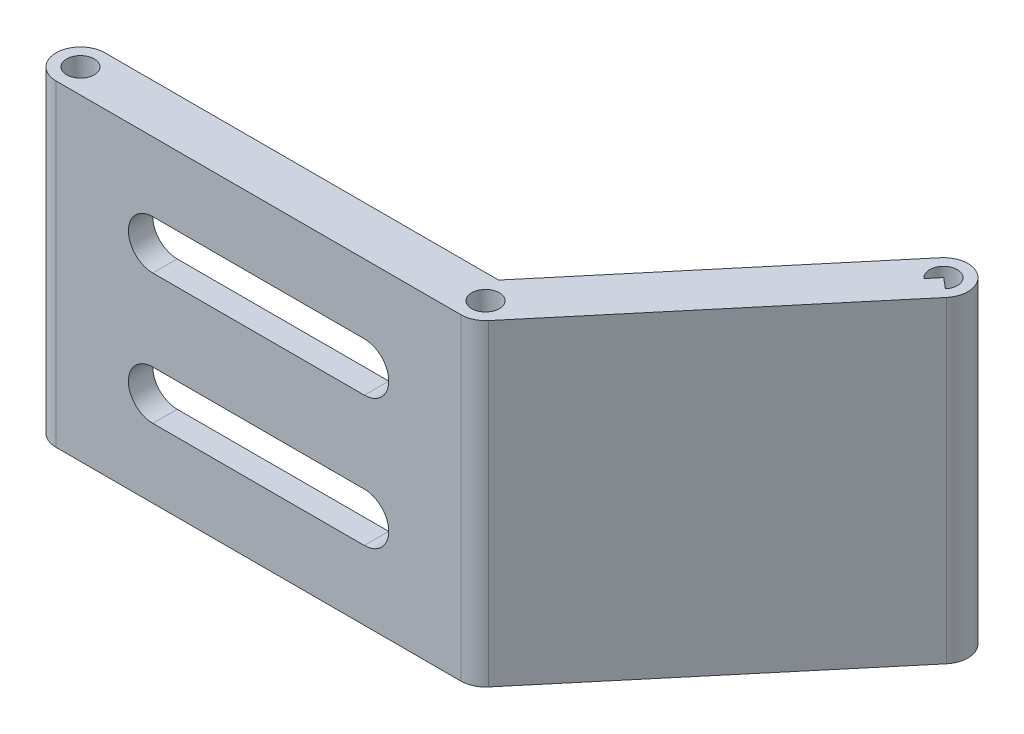
ISO-10303-21;
HEADER;
FILE_DESCRIPTION(('STEP AP214'),'2;1');
FILE_NAME('part.step','',(''),(''),'','','');
FILE_SCHEMA(('AUTOMOTIVE_DESIGN { 1 0 10303 214 1 1 1 1 }'));
ENDSEC;
DATA;
#1=APPLICATION_CONTEXT('core data for automotive mechanical design processes');
#2=APPLICATION_PROTOCOL_DEFINITION('international standard','automotive_design',2000,#1);
#3=PRODUCT_CONTEXT('',#1,'mechanical');
#4=PRODUCT('Part','Part','',(#3));
#5=PRODUCT_RELATED_PRODUCT_CATEGORY('part','',(#4));
#6=PRODUCT_DEFINITION_FORMATION('','',#4);
#7=PRODUCT_DEFINITION_CONTEXT('part definition',#1,'design');
#8=PRODUCT_DEFINITION('design','',#6,#7);
#9=PRODUCT_DEFINITION_SHAPE('','',#8);
#10=(LENGTH_UNIT() NAMED_UNIT(*) SI_UNIT(.MILLI.,.METRE.));
#11=(NAMED_UNIT(*) PLANE_ANGLE_UNIT() SI_UNIT($,.RADIAN.));
#12=(NAMED_UNIT(*) SI_UNIT($,.STERADIAN.) SOLID_ANGLE_UNIT());
#13=UNCERTAINTY_MEASURE_WITH_UNIT(LENGTH_MEASURE(1.E-05),#10,'distance_accuracy_value','');
#14=(GEOMETRIC_REPRESENTATION_CONTEXT(3) GLOBAL_UNCERTAINTY_ASSIGNED_CONTEXT((#13)) GLOBAL_UNIT_ASSIGNED_CONTEXT((#10,
#11,#12)) REPRESENTATION_CONTEXT('',''));
#15=CARTESIAN_POINT('',(0.,0.,0.));
#16=DIRECTION('',(0.,0.,1.));
#17=DIRECTION('',(1.,0.,0.));
#18=AXIS2_PLACEMENT_3D('',#15,#16,#17);
#19=CARTESIAN_POINT('',(61.1988808877318,39.,-30.620225145052));
#20=DIRECTION('',(-0.642787609686542,0.,0.766044443118975));
#21=DIRECTION('',(0.766044443118976,0.,0.642787609686542));
#22=AXIS2_PLACEMENT_3D('',#19,#20,#21);
#23=PLANE('',#22);
#24=DIRECTION('',(-0.766044443118975,0.,-0.642787609686542));
#25=VECTOR('',#24,1.);
#26=CARTESIAN_POINT('',(61.1988808877318,0.,-30.620225145052));
#27=LINE('',#26,#25);
#28=CARTESIAN_POINT('',(63.4970142170887,0.,-28.6918623159923));
#29=VERTEX_POINT('',#28);
#30=CARTESIAN_POINT('',(63.4969810572547,0.,-28.6918901403968));
#31=VERTEX_POINT('',#30);
#32=EDGE_CURVE('E493',#29,#31,#27,.T.);
#33=ORIENTED_EDGE('',*,*,#32,.T.);
#34=DIRECTION('',(0.,1.,0.));
#35=VECTOR('',#34,1.);
#36=CARTESIAN_POINT('',(63.4969810572547,36.,-28.6918901403968));
#37=LINE('',#36,#35);
#38=CARTESIAN_POINT('',(63.4969810572547,39.,-28.6918901403968));
#39=VERTEX_POINT('',#38);
#40=EDGE_CURVE('E48',#31,#39,#37,.T.);
#41=ORIENTED_EDGE('',*,*,#40,.T.);
#42=DIRECTION('',(-0.766044443118975,0.,-0.642787609686542));
#43=VECTOR('',#42,1.);
#44=CARTESIAN_POINT('',(61.1988808877318,39.,-30.620225145052));
#45=LINE('',#44,#43);
#46=CARTESIAN_POINT('',(63.4970142170887,39.,-28.6918623159923));
#47=VERTEX_POINT('',#46);
#48=EDGE_CURVE('E469',#47,#39,#45,.T.);
#49=ORIENTED_EDGE('',*,*,#48,.F.);
#50=DIRECTION('',(0.,-1.,0.));
#51=VECTOR('',#50,1.);
#52=CARTESIAN_POINT('',(63.4970142170887,39.,-28.6918623159923));
#53=LINE('',#52,#51);
#54=EDGE_CURVE('E502',#47,#29,#53,.T.);
#55=ORIENTED_EDGE('',*,*,#54,.T.);
#56=EDGE_LOOP('',(#33,#41,#49,#55));
#57=FACE_BOUND('',#56,.T.);
#58=ADVANCED_FACE('F39',(#57),#23,.F.);
#59=CARTESIAN_POINT('',(37.4338240910131,39.,-2.29813332935694));
#60=DIRECTION('',(0.766044443118979,0.,0.642787609686538));
#61=DIRECTION('',(0.642787609686538,0.,-0.766044443118979));
#62=AXIS2_PLACEMENT_3D('',#59,#60,#61);
#63=PLANE('',#62);
#64=DIRECTION('',(0.,-1.,0.));
#65=VECTOR('',#64,1.);
#66=CARTESIAN_POINT('',(59.2601589891967,39.,-28.3097463574317));
#67=LINE('',#66,#65);
#68=CARTESIAN_POINT('',(59.2601589891967,5.,-28.3097463574317));
#69=VERTEX_POINT('',#68);
#70=CARTESIAN_POINT('',(59.2601589891967,36.,-28.3097463574317));
#71=VERTEX_POINT('',#70);
#72=EDGE_CURVE('E241',#69,#71,#67,.F.);
#73=ORIENTED_EDGE('',*,*,#72,.F.);
#74=DIRECTION('',(-0.642787609686538,0.,0.766044443118979));
#75=VECTOR('',#74,1.);
#76=CARTESIAN_POINT('',(37.4338240910131,5.,-2.29813332935694));
#77=LINE('',#76,#75);
#78=CARTESIAN_POINT('',(40.8448561593638,5.,-6.3632430512679));
#79=VERTEX_POINT('',#78);
#80=EDGE_CURVE('E55',#69,#79,#77,.T.);
#81=ORIENTED_EDGE('',*,*,#80,.T.);
#82=DIRECTION('',(0.,1.,0.));
#83=VECTOR('',#82,1.);
#84=CARTESIAN_POINT('',(40.8448561593638,39.,-6.3632430512679));
#85=LINE('',#84,#83);
#86=CARTESIAN_POINT('',(40.8448561593638,36.,-6.3632430512679));
#87=VERTEX_POINT('',#86);
#88=EDGE_CURVE('E522',#79,#87,#85,.T.);
#89=ORIENTED_EDGE('',*,*,#88,.T.);
#90=DIRECTION('',(-0.642787609686538,0.,0.766044443118979));
#91=VECTOR('',#90,1.);
#92=CARTESIAN_POINT('',(37.4338240910131,36.,-2.29813332935694));
#93=LINE('',#92,#91);
#94=EDGE_CURVE('E286',#71,#87,#93,.T.);
#95=ORIENTED_EDGE('',*,*,#94,.F.);
#96=EDGE_LOOP('',(#73,#81,#89,#95));
#97=FACE_BOUND('',#96,.T.);
#98=ADVANCED_FACE('F617',(#97),#63,.F.);
#99=CARTESIAN_POINT('',(-14.2777011975798,5.,0.));
#100=DIRECTION('',(0.,1.,0.));
#101=DIRECTION('',(0.,0.,1.));
#102=AXIS2_PLACEMENT_3D('',#99,#100,#101);
#103=PLANE('',#102);
#104=ORIENTED_EDGE('',*,*,#80,.F.);
#105=CARTESIAN_POINT('',(61.1885218182563,5.,-30.6078796867887));
#106=DIRECTION('',(0.,1.,0.));
#107=DIRECTION('',(0.,0.,1.));
#108=AXIS2_PLACEMENT_3D('',#105,#106,#107);
#109=CIRCLE('',#108,3.00000000000005);
#110=CARTESIAN_POINT('',(58.8903884888994,5.,-32.5362425158483));
#111=VERTEX_POINT('',#110);
#112=EDGE_CURVE('E233',#69,#111,#109,.F.);
#113=ORIENTED_EDGE('',*,*,#112,.T.);
#114=DIRECTION('',(-0.642787609686538,0.,0.766044443118979));
#115=VECTOR('',#114,1.);
#116=CARTESIAN_POINT('',(33.2073279325966,5.,-1.92836282905961));
#117=LINE('',#116,#115);
#118=CARTESIAN_POINT('',(34.1065382874885,5.,-3.));
#119=VERTEX_POINT('',#118);
#120=EDGE_CURVE('E237',#111,#119,#117,.T.);
#121=ORIENTED_EDGE('',*,*,#120,.T.);
#122=DIRECTION('',(-1.,0.,0.));
#123=VECTOR('',#122,1.);
#124=CARTESIAN_POINT('',(-14.2777011975798,5.,-3.));
#125=LINE('',#124,#123);
#126=CARTESIAN_POINT('',(-14.2777011975798,5.,-3.));
#127=VERTEX_POINT('',#126);
#128=EDGE_CURVE('E408',#119,#127,#125,.T.);
#129=ORIENTED_EDGE('',*,*,#128,.T.);
#130=CARTESIAN_POINT('',(-14.2777011975798,5.,0.));
#131=DIRECTION('',(0.,1.,0.));
#132=DIRECTION('',(0.,0.,1.));
#133=AXIS2_PLACEMENT_3D('',#130,#131,#132);
#134=CIRCLE('',#133,3.);
#135=CARTESIAN_POINT('',(-12.3607879984449,5.,-2.30769230769231));
#136=VERTEX_POINT('',#135);
#137=EDGE_CURVE('E417',#136,#127,#134,.T.);
#138=ORIENTED_EDGE('',*,*,#137,.F.);
#139=CARTESIAN_POINT('',(-5.97107733466174,5.,-10.));
#140=DIRECTION('',(0.,1.,0.));
#141=DIRECTION('',(0.,0.,1.));
#142=AXIS2_PLACEMENT_3D('',#139,#140,#141);
#143=CIRCLE('',#142,10.);
#144=CARTESIAN_POINT('',(-5.97107733466174,5.,0.));
#145=VERTEX_POINT('',#144);
#146=EDGE_CURVE('E442',#145,#136,#143,.F.);
#147=ORIENTED_EDGE('',*,*,#146,.F.);
#148=DIRECTION('',(-1.,0.,0.));
#149=VECTOR('',#148,1.);
#150=CARTESIAN_POINT('',(-11.2777011975798,5.,0.));
#151=LINE('',#150,#149);
#152=CARTESIAN_POINT('',(27.1988373990354,5.,0.));
#153=VERTEX_POINT('',#152);
#154=EDGE_CURVE('E421',#153,#145,#151,.T.);
#155=ORIENTED_EDGE('',*,*,#154,.F.);
#156=CARTESIAN_POINT('',(27.1988373990354,5.,-10.));
#157=DIRECTION('',(0.,1.,0.));
#158=DIRECTION('',(0.,0.,1.));
#159=AXIS2_PLACEMENT_3D('',#156,#157,#158);
#160=CIRCLE('',#159,10.);
#161=CARTESIAN_POINT('',(33.5885480628186,5.,-2.30769230769231));
#162=VERTEX_POINT('',#161);
#163=EDGE_CURVE('E425',#162,#153,#160,.F.);
#164=ORIENTED_EDGE('',*,*,#163,.F.);
#165=CARTESIAN_POINT('',(35.5054612619535,5.,0.));
#166=DIRECTION('',(0.,1.,0.));
#167=DIRECTION('',(0.,0.,1.));
#168=AXIS2_PLACEMENT_3D('',#165,#166,#167);
#169=CIRCLE('',#168,3.);
#170=CARTESIAN_POINT('',(34.9698344464659,5.,-2.9517967264923));
#171=VERTEX_POINT('',#170);
#172=EDGE_CURVE('E428',#171,#162,#169,.T.);
#173=ORIENTED_EDGE('',*,*,#172,.F.);
#174=CARTESIAN_POINT('',(33.184411728174,5.,-12.7911191481333));
#175=DIRECTION('',(0.,1.,0.));
#176=DIRECTION('',(0.,0.,1.));
#177=AXIS2_PLACEMENT_3D('',#174,#175,#176);
#178=CIRCLE('',#177,10.);
#179=EDGE_CURVE('E432',#79,#171,#178,.F.);
#180=ORIENTED_EDGE('',*,*,#179,.F.);
#181=EDGE_LOOP('',(#104,#113,#121,#129,#138,#147,#155,#164,#173,#180));
#182=FACE_BOUND('',#181,.T.);
#183=ADVANCED_FACE('F235',(#182),#103,.T.);
#184=CARTESIAN_POINT('',(-14.2777011975798,36.,0.));
#185=DIRECTION('',(0.,1.,0.));
#186=DIRECTION('',(0.,0.,1.));
#187=AXIS2_PLACEMENT_3D('',#184,#185,#186);
#188=PLANE('',#187);
#189=CARTESIAN_POINT('',(61.1885218182563,36.,-30.6078796867887));
#190=DIRECTION('',(0.,1.,0.));
#191=DIRECTION('',(0.,0.,1.));
#192=AXIS2_PLACEMENT_3D('',#189,#190,#191);
#193=CIRCLE('',#192,3.00000000000005);
#194=CARTESIAN_POINT('',(58.8903884888994,36.,-32.5362425158483));
#195=VERTEX_POINT('',#194);
#196=EDGE_CURVE('E555',#71,#195,#193,.F.);
#197=ORIENTED_EDGE('',*,*,#196,.F.);
#198=ORIENTED_EDGE('',*,*,#94,.T.);
#199=CARTESIAN_POINT('',(33.184411728174,36.,-12.7911191481333));
#200=DIRECTION('',(0.,1.,0.));
#201=DIRECTION('',(0.,0.,1.));
#202=AXIS2_PLACEMENT_3D('',#199,#200,#201);
#203=CIRCLE('',#202,10.);
#204=CARTESIAN_POINT('',(34.9698344464659,36.,-2.9517967264923));
#205=VERTEX_POINT('',#204);
#206=EDGE_CURVE('E404',#87,#205,#203,.F.);
#207=ORIENTED_EDGE('',*,*,#206,.T.);
#208=CARTESIAN_POINT('',(35.5054612619535,36.,0.));
#209=DIRECTION('',(0.,1.,0.));
#210=DIRECTION('',(0.,0.,1.));
#211=AXIS2_PLACEMENT_3D('',#208,#209,#210);
#212=CIRCLE('',#211,3.);
#213=CARTESIAN_POINT('',(33.5885480628186,36.,-2.30769230769231));
#214=VERTEX_POINT('',#213);
#215=EDGE_CURVE('E401',#205,#214,#212,.T.);
#216=ORIENTED_EDGE('',*,*,#215,.T.);
#217=CARTESIAN_POINT('',(27.1988373990354,36.,-10.));
#218=DIRECTION('',(0.,1.,0.));
#219=DIRECTION('',(0.,0.,1.));
#220=AXIS2_PLACEMENT_3D('',#217,#218,#219);
#221=CIRCLE('',#220,10.);
#222=CARTESIAN_POINT('',(27.1988373990354,36.,0.));
#223=VERTEX_POINT('',#222);
#224=EDGE_CURVE('E398',#214,#223,#221,.F.);
#225=ORIENTED_EDGE('',*,*,#224,.T.);
#226=DIRECTION('',(-1.,0.,0.));
#227=VECTOR('',#226,1.);
#228=CARTESIAN_POINT('',(-11.2777011975798,36.,0.));
#229=LINE('',#228,#227);
#230=CARTESIAN_POINT('',(-5.97107733466174,36.,0.));
#231=VERTEX_POINT('',#230);
#232=EDGE_CURVE('E395',#223,#231,#229,.T.);
#233=ORIENTED_EDGE('',*,*,#232,.T.);
#234=CARTESIAN_POINT('',(-5.97107733466174,36.,-10.));
#235=DIRECTION('',(0.,1.,0.));
#236=DIRECTION('',(0.,0.,1.));
#237=AXIS2_PLACEMENT_3D('',#234,#235,#236);
#238=CIRCLE('',#237,10.);
#239=CARTESIAN_POINT('',(-12.3607879984449,36.,-2.30769230769231));
#240=VERTEX_POINT('',#239);
#241=EDGE_CURVE('E446',#231,#240,#238,.F.);
#242=ORIENTED_EDGE('',*,*,#241,.T.);
#243=CARTESIAN_POINT('',(-14.2777011975798,36.,0.));
#244=DIRECTION('',(0.,1.,0.));
#245=DIRECTION('',(0.,0.,1.));
#246=AXIS2_PLACEMENT_3D('',#243,#244,#245);
#247=CIRCLE('',#246,3.);
#248=CARTESIAN_POINT('',(-14.2777011975798,36.,-3.));
#249=VERTEX_POINT('',#248);
#250=EDGE_CURVE('E391',#240,#249,#247,.T.);
#251=ORIENTED_EDGE('',*,*,#250,.T.);
#252=DIRECTION('',(-1.,0.,0.));
#253=VECTOR('',#252,1.);
#254=CARTESIAN_POINT('',(-14.2777011975798,36.,-3.));
#255=LINE('',#254,#253);
#256=CARTESIAN_POINT('',(34.1065382874885,36.,-3.));
#257=VERTEX_POINT('',#256);
#258=EDGE_CURVE('E382',#257,#249,#255,.T.);
#259=ORIENTED_EDGE('',*,*,#258,.F.);
#260=DIRECTION('',(-0.642787609686538,0.,0.766044443118979));
#261=VECTOR('',#260,1.);
#262=CARTESIAN_POINT('',(33.2073279325966,36.,-1.92836282905961));
#263=LINE('',#262,#261);
#264=EDGE_CURVE('E270',#195,#257,#263,.T.);
#265=ORIENTED_EDGE('',*,*,#264,.F.);
#266=EDGE_LOOP('',(#197,#198,#207,#216,#225,#233,#242,#251,#259,#265));
#267=FACE_BOUND('',#266,.T.);
#268=ADVANCED_FACE('F611',(#267),#188,.F.);
#269=DIRECTION('',(0.,1.,0.));
#270=VECTOR('',#269,1.);
#271=CARTESIAN_POINT('',(62.5010979227874,36.,-29.527535311224));
#272=LINE('',#271,#270);
#273=CARTESIAN_POINT('',(62.5010979227874,0.,-29.527535311224));
#274=VERTEX_POINT('',#273);
#275=CARTESIAN_POINT('',(62.5010979227874,39.,-29.527535311224));
#276=VERTEX_POINT('',#275);
#277=EDGE_CURVE('E289',#274,#276,#272,.T.);
#278=ORIENTED_EDGE('',*,*,#277,.F.);
#279=CARTESIAN_POINT('',(61.1988808877318,0.,-30.620225145052));
#280=VERTEX_POINT('',#279);
#281=EDGE_CURVE('E492',#274,#280,#27,.T.);
#282=ORIENTED_EDGE('',*,*,#281,.T.);
#283=DIRECTION('',(0.,-1.,0.));
#284=VECTOR('',#283,1.);
#285=CARTESIAN_POINT('',(61.1988808877318,39.,-30.620225145052));
#286=LINE('',#285,#284);
#287=CARTESIAN_POINT('',(61.1988808877318,39.,-30.620225145052));
#288=VERTEX_POINT('',#287);
#289=EDGE_CURVE('E477',#288,#280,#286,.T.);
#290=ORIENTED_EDGE('',*,*,#289,.F.);
#291=EDGE_CURVE('E468',#276,#288,#45,.T.);
#292=ORIENTED_EDGE('',*,*,#291,.F.);
#293=EDGE_LOOP('',(#278,#282,#290,#292));
#294=FACE_BOUND('',#293,.T.);
#295=ADVANCED_FACE('F633',(#294),#23,.F.);
#296=CARTESIAN_POINT('',(-14.2777011975798,5.,-3.));
#297=DIRECTION('',(0.,0.,1.));
#298=DIRECTION('',(1.,0.,0.));
#299=AXIS2_PLACEMENT_3D('',#296,#297,#298);
#300=PLANE('',#299);
#301=DIRECTION('',(0.,1.,0.));
#302=VECTOR('',#301,1.);
#303=CARTESIAN_POINT('',(34.1065382874885,5.,-3.));
#304=LINE('',#303,#302);
#305=CARTESIAN_POINT('',(34.1065382874885,0.,-3.));
#306=VERTEX_POINT('',#305);
#307=EDGE_CURVE('E11',#306,#119,#304,.T.);
#308=ORIENTED_EDGE('',*,*,#307,.F.);
#309=DIRECTION('',(-1.,0.,0.));
#310=VECTOR('',#309,1.);
#311=CARTESIAN_POINT('',(-14.2777011975798,0.,-3.));
#312=LINE('',#311,#310);
#313=CARTESIAN_POINT('',(-14.2777011975798,0.,-3.));
#314=VERTEX_POINT('',#313);
#315=EDGE_CURVE('E407',#306,#314,#312,.T.);
#316=ORIENTED_EDGE('',*,*,#315,.T.);
#317=DIRECTION('',(0.,-1.,0.));
#318=VECTOR('',#317,1.);
#319=CARTESIAN_POINT('',(-14.2777011975798,5.,-3.));
#320=LINE('',#319,#318);
#321=EDGE_CURVE('E411',#127,#314,#320,.T.);
#322=ORIENTED_EDGE('',*,*,#321,.F.);
#323=ORIENTED_EDGE('',*,*,#128,.F.);
#324=EDGE_LOOP('',(#308,#316,#322,#323));
#325=FACE_BOUND('',#324,.T.);
#326=ADVANCED_FACE('F590',(#325),#300,.F.);
#327=CARTESIAN_POINT('',(33.184411728174,39.,-12.7911191481333));
#328=DIRECTION('',(0.,-1.,0.));
#329=DIRECTION('',(0.,0.,-1.));
#330=AXIS2_PLACEMENT_3D('',#327,#328,#329);
#331=CYLINDRICAL_SURFACE('',#330,10.);
#332=ORIENTED_EDGE('',*,*,#88,.F.);
#333=ORIENTED_EDGE('',*,*,#179,.T.);
#334=DIRECTION('',(0.,-1.,0.));
#335=VECTOR('',#334,1.);
#336=CARTESIAN_POINT('',(34.9698344464659,39.,-2.9517967264923));
#337=LINE('',#336,#335);
#338=EDGE_CURVE('E519',#205,#171,#337,.T.);
#339=ORIENTED_EDGE('',*,*,#338,.F.);
#340=ORIENTED_EDGE('',*,*,#206,.F.);
#341=EDGE_LOOP('',(#332,#333,#339,#340));
#342=FACE_BOUND('',#341,.T.);
#343=ADVANCED_FACE('F615',(#342),#331,.F.);
#344=DIRECTION('',(-0.642787609686538,0.,0.766044443118979));
#345=VECTOR('',#344,1.);
#346=CARTESIAN_POINT('',(37.4338240910131,0.,-2.29813332935694));
#347=LINE('',#346,#345);
#348=CARTESIAN_POINT('',(60.0957828817892,0.,-29.3056041334864));
#349=VERTEX_POINT('',#348);
#350=EDGE_CURVE('E459',#280,#349,#347,.T.);
#351=ORIENTED_EDGE('',*,*,#350,.T.);
#352=DIRECTION('',(0.,1.,0.));
#353=VECTOR('',#352,1.);
#354=CARTESIAN_POINT('',(60.0957828817892,36.,-29.3056041334864));
#355=LINE('',#354,#353);
#356=CARTESIAN_POINT('',(60.0957828817892,39.,-29.3056041334864));
#357=VERTEX_POINT('',#356);
#358=EDGE_CURVE('E63',#357,#349,#355,.F.);
#359=ORIENTED_EDGE('',*,*,#358,.F.);
#360=DIRECTION('',(-0.642787609686538,0.,0.766044443118979));
#361=VECTOR('',#360,1.);
#362=CARTESIAN_POINT('',(37.4338240910131,39.,-2.29813332935694));
#363=LINE('',#362,#361);
#364=EDGE_CURVE('E473',#288,#357,#363,.T.);
#365=ORIENTED_EDGE('',*,*,#364,.F.);
#366=ORIENTED_EDGE('',*,*,#289,.T.);
#367=EDGE_LOOP('',(#351,#359,#365,#366));
#368=FACE_BOUND('',#367,.T.);
#369=ADVANCED_FACE('F632',(#368),#63,.F.);
#370=CARTESIAN_POINT('',(35.5054612619535,39.,0.));
#371=DIRECTION('',(0.,-1.,0.));
#372=DIRECTION('',(0.,0.,-1.));
#373=AXIS2_PLACEMENT_3D('',#370,#371,#372);
#374=CYLINDRICAL_SURFACE('',#373,3.);
#375=ORIENTED_EDGE('',*,*,#215,.F.);
#376=ORIENTED_EDGE('',*,*,#338,.T.);
#377=ORIENTED_EDGE('',*,*,#172,.T.);
#378=DIRECTION('',(0.,-1.,0.));
#379=VECTOR('',#378,1.);
#380=CARTESIAN_POINT('',(33.5885480628186,39.,-2.30769230769231));
#381=LINE('',#380,#379);
#382=EDGE_CURVE('E515',#162,#214,#381,.F.);
#383=ORIENTED_EDGE('',*,*,#382,.T.);
#384=EDGE_LOOP('',(#375,#376,#377,#383));
#385=FACE_BOUND('',#384,.T.);
#386=ADVANCED_FACE('F606',(#385),#374,.T.);
#387=CARTESIAN_POINT('',(-11.2777011975798,39.,0.));
#388=DIRECTION('',(0.,0.,1.));
#389=DIRECTION('',(1.,0.,0.));
#390=AXIS2_PLACEMENT_3D('',#387,#388,#389);
#391=PLANE('',#390);
#392=DIRECTION('',(-1.,0.,0.));
#393=VECTOR('',#392,1.);
#394=CARTESIAN_POINT('',(-11.2777011975798,30.5,0.));
#395=LINE('',#394,#393);
#396=CARTESIAN_POINT('',(23.6138800321868,30.5,0.));
#397=VERTEX_POINT('',#396);
#398=CARTESIAN_POINT('',(-2.38611996781316,30.5,0.));
#399=VERTEX_POINT('',#398);
#400=EDGE_CURVE('E373',#397,#399,#395,.T.);
#401=ORIENTED_EDGE('',*,*,#400,.T.);
#402=CARTESIAN_POINT('',(-2.38611996781316,27.5,0.));
#403=DIRECTION('',(0.,0.,1.));
#404=DIRECTION('',(1.,0.,0.));
#405=AXIS2_PLACEMENT_3D('',#402,#403,#404);
#406=CIRCLE('',#405,3.);
#407=CARTESIAN_POINT('',(-2.38611996781315,24.5,0.));
#408=VERTEX_POINT('',#407);
#409=EDGE_CURVE('E377',#399,#408,#406,.T.);
#410=ORIENTED_EDGE('',*,*,#409,.T.);
#411=DIRECTION('',(1.,0.,0.));
#412=VECTOR('',#411,1.);
#413=CARTESIAN_POINT('',(-11.2777011975798,24.5,0.));
#414=LINE('',#413,#412);
#415=CARTESIAN_POINT('',(23.6138800321868,24.5,0.));
#416=VERTEX_POINT('',#415);
#417=EDGE_CURVE('E365',#408,#416,#414,.T.);
#418=ORIENTED_EDGE('',*,*,#417,.T.);
#419=CARTESIAN_POINT('',(23.6138800321868,27.5,0.));
#420=DIRECTION('',(0.,0.,1.));
#421=DIRECTION('',(1.,0.,0.));
#422=AXIS2_PLACEMENT_3D('',#419,#420,#421);
#423=CIRCLE('',#422,3.);
#424=EDGE_CURVE('E369',#416,#397,#423,.T.);
#425=ORIENTED_EDGE('',*,*,#424,.T.);
#426=EDGE_LOOP('',(#401,#410,#418,#425));
#427=FACE_BOUND('',#426,.T.);
#428=DIRECTION('',(-1.,0.,0.));
#429=VECTOR('',#428,1.);
#430=CARTESIAN_POINT('',(-11.2777011975798,14.5,0.));
#431=LINE('',#430,#429);
#432=CARTESIAN_POINT('',(23.6138800321868,14.5,0.));
#433=VERTEX_POINT('',#432);
#434=CARTESIAN_POINT('',(-2.38611996781315,14.5,0.));
#435=VERTEX_POINT('',#434);
#436=EDGE_CURVE('E357',#433,#435,#431,.T.);
#437=ORIENTED_EDGE('',*,*,#436,.T.);
#438=CARTESIAN_POINT('',(-2.38611996781316,11.5,0.));
#439=DIRECTION('',(0.,0.,1.));
#440=DIRECTION('',(1.,0.,0.));
#441=AXIS2_PLACEMENT_3D('',#438,#439,#440);
#442=CIRCLE('',#441,3.);
#443=CARTESIAN_POINT('',(-2.38611996781315,8.5,0.));
#444=VERTEX_POINT('',#443);
#445=EDGE_CURVE('E361',#435,#444,#442,.T.);
#446=ORIENTED_EDGE('',*,*,#445,.T.);
#447=DIRECTION('',(1.,0.,0.));
#448=VECTOR('',#447,1.);
#449=CARTESIAN_POINT('',(-11.2777011975798,8.5,0.));
#450=LINE('',#449,#448);
#451=CARTESIAN_POINT('',(23.6138800321868,8.5,0.));
#452=VERTEX_POINT('',#451);
#453=EDGE_CURVE('E314',#444,#452,#450,.T.);
#454=ORIENTED_EDGE('',*,*,#453,.T.);
#455=CARTESIAN_POINT('',(23.6138800321868,11.5,0.));
#456=DIRECTION('',(0.,0.,1.));
#457=DIRECTION('',(1.,0.,0.));
#458=AXIS2_PLACEMENT_3D('',#455,#456,#457);
#459=CIRCLE('',#458,3.);
#460=EDGE_CURVE('E353',#452,#433,#459,.T.);
#461=ORIENTED_EDGE('',*,*,#460,.T.);
#462=EDGE_LOOP('',(#437,#446,#454,#461));
#463=FACE_BOUND('',#462,.T.);
#464=ORIENTED_EDGE('',*,*,#232,.F.);
#465=DIRECTION('',(0.,1.,0.));
#466=VECTOR('',#465,1.);
#467=CARTESIAN_POINT('',(27.1988373990354,0.,0.));
#468=LINE('',#467,#466);
#469=EDGE_CURVE('E529',#223,#153,#468,.F.);
#470=ORIENTED_EDGE('',*,*,#469,.T.);
#471=ORIENTED_EDGE('',*,*,#154,.T.);
#472=DIRECTION('',(0.,1.,0.));
#473=VECTOR('',#472,1.);
#474=CARTESIAN_POINT('',(-5.97107733466174,39.,0.));
#475=LINE('',#474,#473);
#476=EDGE_CURVE('E525',#145,#231,#475,.T.);
#477=ORIENTED_EDGE('',*,*,#476,.T.);
#478=EDGE_LOOP('',(#464,#470,#471,#477));
#479=FACE_BOUND('',#478,.T.);
#480=ADVANCED_FACE('F599',(#427,#463,#479),#391,.F.);
#481=CARTESIAN_POINT('',(27.1988373990354,39.,-10.));
#482=DIRECTION('',(0.,-1.,0.));
#483=DIRECTION('',(0.,0.,-1.));
#484=AXIS2_PLACEMENT_3D('',#481,#482,#483);
#485=CYLINDRICAL_SURFACE('',#484,10.);
#486=ORIENTED_EDGE('',*,*,#224,.F.);
#487=ORIENTED_EDGE('',*,*,#382,.F.);
#488=ORIENTED_EDGE('',*,*,#163,.T.);
#489=ORIENTED_EDGE('',*,*,#469,.F.);
#490=EDGE_LOOP('',(#486,#487,#488,#489));
#491=FACE_BOUND('',#490,.T.);
#492=ADVANCED_FACE('F609',(#491),#485,.F.);
#493=CARTESIAN_POINT('',(-5.97107733466174,39.,-10.));
#494=DIRECTION('',(0.,-1.,0.));
#495=DIRECTION('',(0.,0.,-1.));
#496=AXIS2_PLACEMENT_3D('',#493,#494,#495);
#497=CYLINDRICAL_SURFACE('',#496,10.);
#498=ORIENTED_EDGE('',*,*,#241,.F.);
#499=ORIENTED_EDGE('',*,*,#476,.F.);
#500=ORIENTED_EDGE('',*,*,#146,.T.);
#501=DIRECTION('',(0.,-1.,0.));
#502=VECTOR('',#501,1.);
#503=CARTESIAN_POINT('',(-12.3607879984449,39.,-2.30769230769231));
#504=LINE('',#503,#502);
#505=EDGE_CURVE('E533',#240,#136,#504,.T.);
#506=ORIENTED_EDGE('',*,*,#505,.F.);
#507=EDGE_LOOP('',(#498,#499,#500,#506));
#508=FACE_BOUND('',#507,.T.);
#509=ADVANCED_FACE('F41',(#508),#497,.F.);
#510=CARTESIAN_POINT('',(35.5054612619535,39.,0.));
#511=DIRECTION('',(0.,1.,0.));
#512=DIRECTION('',(0.,0.,1.));
#513=AXIS2_PLACEMENT_3D('',#510,#511,#512);
#514=PLANE('',#513);
#515=DIRECTION('',(0.642787609686538,0.,-0.766044443118979));
#516=VECTOR('',#515,1.);
#517=CARTESIAN_POINT('',(37.8035945913104,39.,1.92836282905961));
#518=LINE('',#517,#516);
#519=CARTESIAN_POINT('',(37.8035945913104,39.,1.92836282905961));
#520=VERTEX_POINT('',#519);
#521=EDGE_CURVE('E465',#520,#47,#518,.T.);
#522=ORIENTED_EDGE('',*,*,#521,.T.);
#523=ORIENTED_EDGE('',*,*,#48,.T.);
#524=CARTESIAN_POINT('',(61.1885218182563,39.,-30.6078796867887));
#525=DIRECTION('',(0.,1.,0.));
#526=DIRECTION('',(0.,0.,1.));
#527=AXIS2_PLACEMENT_3D('',#524,#525,#526);
#528=CIRCLE('',#527,3.);
#529=CARTESIAN_POINT('',(58.8903884888994,39.,-32.5362425158483));
#530=VERTEX_POINT('',#529);
#531=EDGE_CURVE('E269',#39,#530,#528,.T.);
#532=ORIENTED_EDGE('',*,*,#531,.T.);
#533=DIRECTION('',(-0.642787609686538,0.,0.766044443118979));
#534=VECTOR('',#533,1.);
#535=CARTESIAN_POINT('',(33.2073279325966,39.,-1.92836282905961));
#536=LINE('',#535,#534);
#537=CARTESIAN_POINT('',(34.1065382874885,39.,-3.));
#538=VERTEX_POINT('',#537);
#539=EDGE_CURVE('E274',#530,#538,#536,.T.);
#540=ORIENTED_EDGE('',*,*,#539,.T.);
#541=DIRECTION('',(-1.,0.,0.));
#542=VECTOR('',#541,1.);
#543=CARTESIAN_POINT('',(-14.2777011975798,39.,-3.));
#544=LINE('',#543,#542);
#545=CARTESIAN_POINT('',(-14.2777011975798,39.,-3.));
#546=VERTEX_POINT('',#545);
#547=EDGE_CURVE('E381',#538,#546,#544,.T.);
#548=ORIENTED_EDGE('',*,*,#547,.T.);
#549=CARTESIAN_POINT('',(-14.2777011975798,39.,0.));
#550=DIRECTION('',(0.,1.,0.));
#551=DIRECTION('',(0.,0.,1.));
#552=AXIS2_PLACEMENT_3D('',#549,#550,#551);
#553=CIRCLE('',#552,3.);
#554=CARTESIAN_POINT('',(-14.2777011975798,39.,3.));
#555=VERTEX_POINT('',#554);
#556=EDGE_CURVE('E455',#546,#555,#553,.T.);
#557=ORIENTED_EDGE('',*,*,#556,.T.);
#558=DIRECTION('',(1.,0.,0.));
#559=VECTOR('',#558,1.);
#560=CARTESIAN_POINT('',(-14.2777011975798,39.,3.));
#561=LINE('',#560,#559);
#562=CARTESIAN_POINT('',(35.5054612619535,39.,3.));
#563=VERTEX_POINT('',#562);
#564=EDGE_CURVE('E458',#555,#563,#561,.T.);
#565=ORIENTED_EDGE('',*,*,#564,.T.);
#566=CARTESIAN_POINT('',(35.5054612619535,39.,0.));
#567=DIRECTION('',(0.,1.,0.));
#568=DIRECTION('',(0.,0.,1.));
#569=AXIS2_PLACEMENT_3D('',#566,#567,#568);
#570=CIRCLE('',#569,3.);
#571=EDGE_CURVE('E462',#563,#520,#570,.T.);
#572=ORIENTED_EDGE('',*,*,#571,.T.);
#573=EDGE_LOOP('',(#522,#523,#532,#540,#548,#557,#565,#572));
#574=FACE_BOUND('',#573,.T.);
#575=CARTESIAN_POINT('',(35.5054612619535,39.,0.));
#576=DIRECTION('',(0.,1.,0.));
#577=DIRECTION('',(0.,0.,1.));
#578=AXIS2_PLACEMENT_3D('',#575,#576,#577);
#579=CIRCLE('',#578,1.7);
#580=CARTESIAN_POINT('',(35.5054612619535,39.,1.7));
#581=VERTEX_POINT('',#580);
#582=EDGE_CURVE('E436',#581,#581,#579,.T.);
#583=ORIENTED_EDGE('',*,*,#582,.F.);
#584=EDGE_LOOP('',(#583));
#585=FACE_BOUND('',#584,.T.);
#586=CARTESIAN_POINT('',(-14.2777011975798,39.,0.));
#587=DIRECTION('',(0.,1.,0.));
#588=DIRECTION('',(0.,0.,1.));
#589=AXIS2_PLACEMENT_3D('',#586,#587,#588);
#590=CIRCLE('',#589,1.7);
#591=CARTESIAN_POINT('',(-14.2777011975798,39.,1.7));
#592=VERTEX_POINT('',#591);
#593=EDGE_CURVE('E450',#592,#592,#590,.T.);
#594=ORIENTED_EDGE('',*,*,#593,.F.);
#595=EDGE_LOOP('',(#594));
#596=FACE_BOUND('',#595,.T.);
#597=ORIENTED_EDGE('',*,*,#364,.T.);
#598=CARTESIAN_POINT('',(61.1885218182563,39.,-30.6078796867887));
#599=DIRECTION('',(0.,1.,0.));
#600=DIRECTION('',(0.,0.,1.));
#601=AXIS2_PLACEMENT_3D('',#598,#599,#600);
#602=CIRCLE('',#601,1.70000000000001);
#603=EDGE_CURVE('E266',#276,#357,#602,.T.);
#604=ORIENTED_EDGE('',*,*,#603,.F.);
#605=ORIENTED_EDGE('',*,*,#291,.T.);
#606=EDGE_LOOP('',(#597,#604,#605));
#607=FACE_BOUND('',#606,.T.);
#608=ADVANCED_FACE('F548',(#574,#585,#596,#607),#514,.T.);
#609=CARTESIAN_POINT('',(35.5054612619535,0.,0.));
#610=DIRECTION('',(0.,1.,0.));
#611=DIRECTION('',(0.,0.,1.));
#612=AXIS2_PLACEMENT_3D('',#609,#610,#611);
#613=PLANE('',#612);
#614=DIRECTION('',(-0.642787609686538,0.,0.766044443118979));
#615=VECTOR('',#614,1.);
#616=CARTESIAN_POINT('',(33.2073279325966,0.,-1.92836282905961));
#617=LINE('',#616,#615);
#618=CARTESIAN_POINT('',(58.8903884888994,0.,-32.5362425158483));
#619=VERTEX_POINT('',#618);
#620=EDGE_CURVE('E255',#619,#306,#617,.T.);
#621=ORIENTED_EDGE('',*,*,#620,.F.);
#622=CARTESIAN_POINT('',(61.1885218182563,0.,-30.6078796867887));
#623=DIRECTION('',(0.,1.,0.));
#624=DIRECTION('',(0.,0.,1.));
#625=AXIS2_PLACEMENT_3D('',#622,#623,#624);
#626=CIRCLE('',#625,3.);
#627=EDGE_CURVE('E247',#31,#619,#626,.T.);
#628=ORIENTED_EDGE('',*,*,#627,.F.);
#629=ORIENTED_EDGE('',*,*,#32,.F.);
#630=DIRECTION('',(0.642787609686538,0.,-0.766044443118979));
#631=VECTOR('',#630,1.);
#632=CARTESIAN_POINT('',(37.8035945913104,0.,1.92836282905961));
#633=LINE('',#632,#631);
#634=CARTESIAN_POINT('',(37.8035945913104,0.,1.92836282905961));
#635=VERTEX_POINT('',#634);
#636=EDGE_CURVE('E489',#635,#29,#633,.T.);
#637=ORIENTED_EDGE('',*,*,#636,.F.);
#638=CARTESIAN_POINT('',(35.5054612619535,0.,0.));
#639=DIRECTION('',(0.,1.,0.));
#640=DIRECTION('',(0.,0.,1.));
#641=AXIS2_PLACEMENT_3D('',#638,#639,#640);
#642=CIRCLE('',#641,3.);
#643=CARTESIAN_POINT('',(35.5054612619535,0.,3.));
#644=VERTEX_POINT('',#643);
#645=EDGE_CURVE('E485',#644,#635,#642,.T.);
#646=ORIENTED_EDGE('',*,*,#645,.F.);
#647=DIRECTION('',(1.,0.,0.));
#648=VECTOR('',#647,1.);
#649=CARTESIAN_POINT('',(-14.2777011975798,0.,3.));
#650=LINE('',#649,#648);
#651=CARTESIAN_POINT('',(-14.2777011975798,0.,3.));
#652=VERTEX_POINT('',#651);
#653=EDGE_CURVE('E481',#652,#644,#650,.T.);
#654=ORIENTED_EDGE('',*,*,#653,.F.);
#655=CARTESIAN_POINT('',(-14.2777011975798,0.,0.));
#656=DIRECTION('',(0.,1.,0.));
#657=DIRECTION('',(0.,0.,1.));
#658=AXIS2_PLACEMENT_3D('',#655,#656,#657);
#659=CIRCLE('',#658,3.);
#660=EDGE_CURVE('E454',#314,#652,#659,.T.);
#661=ORIENTED_EDGE('',*,*,#660,.F.);
#662=ORIENTED_EDGE('',*,*,#315,.F.);
#663=EDGE_LOOP('',(#621,#628,#629,#637,#646,#654,#661,#662));
#664=FACE_BOUND('',#663,.T.);
#665=ORIENTED_EDGE('',*,*,#281,.F.);
#666=CARTESIAN_POINT('',(61.1885218182563,0.,-30.6078796867887));
#667=DIRECTION('',(0.,1.,0.));
#668=DIRECTION('',(0.,0.,1.));
#669=AXIS2_PLACEMENT_3D('',#666,#667,#668);
#670=CIRCLE('',#669,1.70000000000001);
#671=EDGE_CURVE('E240',#274,#349,#670,.T.);
#672=ORIENTED_EDGE('',*,*,#671,.T.);
#673=ORIENTED_EDGE('',*,*,#350,.F.);
#674=EDGE_LOOP('',(#665,#672,#673));
#675=FACE_BOUND('',#674,.T.);
#676=ADVANCED_FACE('F585',(#664,#675),#613,.F.);
#677=CARTESIAN_POINT('',(-14.2777011975798,39.,0.));
#678=DIRECTION('',(0.,-1.,0.));
#679=DIRECTION('',(0.,0.,-1.));
#680=AXIS2_PLACEMENT_3D('',#677,#678,#679);
#681=CYLINDRICAL_SURFACE('',#680,3.);
#682=ORIENTED_EDGE('',*,*,#556,.F.);
#683=DIRECTION('',(0.,1.,0.));
#684=VECTOR('',#683,1.);
#685=CARTESIAN_POINT('',(-14.2777011975798,36.,-3.));
#686=LINE('',#685,#684);
#687=EDGE_CURVE('E385',#249,#546,#686,.T.);
#688=ORIENTED_EDGE('',*,*,#687,.F.);
#689=ORIENTED_EDGE('',*,*,#250,.F.);
#690=ORIENTED_EDGE('',*,*,#505,.T.);
#691=ORIENTED_EDGE('',*,*,#137,.T.);
#692=ORIENTED_EDGE('',*,*,#321,.T.);
#693=ORIENTED_EDGE('',*,*,#660,.T.);
#694=DIRECTION('',(0.,-1.,0.));
#695=VECTOR('',#694,1.);
#696=CARTESIAN_POINT('',(-14.2777011975798,39.,3.));
#697=LINE('',#696,#695);
#698=EDGE_CURVE('E512',#555,#652,#697,.T.);
#699=ORIENTED_EDGE('',*,*,#698,.F.);
#700=EDGE_LOOP('',(#682,#688,#689,#690,#691,#692,#693,#699));
#701=FACE_BOUND('',#700,.T.);
#702=ADVANCED_FACE('F569',(#701),#681,.T.);
#703=CARTESIAN_POINT('',(-14.2777011975798,39.,3.));
#704=DIRECTION('',(0.,0.,-1.));
#705=DIRECTION('',(-1.,0.,0.));
#706=AXIS2_PLACEMENT_3D('',#703,#704,#705);
#707=PLANE('',#706);
#708=DIRECTION('',(1.,0.,0.));
#709=VECTOR('',#708,1.);
#710=CARTESIAN_POINT('',(-2.38611996781315,24.5,3.));
#711=LINE('',#710,#709);
#712=CARTESIAN_POINT('',(-2.38611996781315,24.5,3.));
#713=VERTEX_POINT('',#712);
#714=CARTESIAN_POINT('',(23.6138800321868,24.5,3.));
#715=VERTEX_POINT('',#714);
#716=EDGE_CURVE('E297',#713,#715,#711,.T.);
#717=ORIENTED_EDGE('',*,*,#716,.F.);
#718=CARTESIAN_POINT('',(-2.38611996781316,27.5,3.));
#719=DIRECTION('',(0.,0.,1.));
#720=DIRECTION('',(1.,0.,0.));
#721=AXIS2_PLACEMENT_3D('',#718,#719,#720);
#722=CIRCLE('',#721,3.);
#723=CARTESIAN_POINT('',(-2.38611996781316,30.5,3.));
#724=VERTEX_POINT('',#723);
#725=EDGE_CURVE('E294',#724,#713,#722,.T.);
#726=ORIENTED_EDGE('',*,*,#725,.F.);
#727=DIRECTION('',(-1.,0.,0.));
#728=VECTOR('',#727,1.);
#729=CARTESIAN_POINT('',(-2.38611996781316,30.5,3.));
#730=LINE('',#729,#728);
#731=CARTESIAN_POINT('',(23.6138800321868,30.5,3.));
#732=VERTEX_POINT('',#731);
#733=EDGE_CURVE('E306',#732,#724,#730,.T.);
#734=ORIENTED_EDGE('',*,*,#733,.F.);
#735=CARTESIAN_POINT('',(23.6138800321868,27.5,3.));
#736=DIRECTION('',(0.,0.,1.));
#737=DIRECTION('',(1.,0.,0.));
#738=AXIS2_PLACEMENT_3D('',#735,#736,#737);
#739=CIRCLE('',#738,3.);
#740=EDGE_CURVE('E302',#715,#732,#739,.T.);
#741=ORIENTED_EDGE('',*,*,#740,.F.);
#742=EDGE_LOOP('',(#717,#726,#734,#741));
#743=FACE_BOUND('',#742,.T.);
#744=DIRECTION('',(1.,0.,0.));
#745=VECTOR('',#744,1.);
#746=CARTESIAN_POINT('',(-2.38611996781315,8.5,3.));
#747=LINE('',#746,#745);
#748=CARTESIAN_POINT('',(-2.38611996781315,8.5,3.));
#749=VERTEX_POINT('',#748);
#750=CARTESIAN_POINT('',(23.6138800321868,8.5,3.));
#751=VERTEX_POINT('',#750);
#752=EDGE_CURVE('E326',#749,#751,#747,.T.);
#753=ORIENTED_EDGE('',*,*,#752,.F.);
#754=CARTESIAN_POINT('',(-2.38611996781316,11.5,3.));
#755=DIRECTION('',(0.,0.,1.));
#756=DIRECTION('',(-1.,0.,0.));
#757=AXIS2_PLACEMENT_3D('',#754,#755,#756);
#758=CIRCLE('',#757,3.);
#759=CARTESIAN_POINT('',(-2.38611996781315,14.5,3.));
#760=VERTEX_POINT('',#759);
#761=EDGE_CURVE('E293',#760,#749,#758,.T.);
#762=ORIENTED_EDGE('',*,*,#761,.F.);
#763=DIRECTION('',(-1.,0.,0.));
#764=VECTOR('',#763,1.);
#765=CARTESIAN_POINT('',(-2.38611996781315,14.5,3.));
#766=LINE('',#765,#764);
#767=CARTESIAN_POINT('',(23.6138800321868,14.5,3.));
#768=VERTEX_POINT('',#767);
#769=EDGE_CURVE('E334',#768,#760,#766,.T.);
#770=ORIENTED_EDGE('',*,*,#769,.F.);
#771=CARTESIAN_POINT('',(23.6138800321868,11.5,3.));
#772=DIRECTION('',(0.,0.,1.));
#773=DIRECTION('',(-1.,0.,0.));
#774=AXIS2_PLACEMENT_3D('',#771,#772,#773);
#775=CIRCLE('',#774,3.);
#776=EDGE_CURVE('E330',#751,#768,#775,.T.);
#777=ORIENTED_EDGE('',*,*,#776,.F.);
#778=EDGE_LOOP('',(#753,#762,#770,#777));
#779=FACE_BOUND('',#778,.T.);
#780=ORIENTED_EDGE('',*,*,#698,.T.);
#781=ORIENTED_EDGE('',*,*,#653,.T.);
#782=DIRECTION('',(0.,-1.,0.));
#783=VECTOR('',#782,1.);
#784=CARTESIAN_POINT('',(35.5054612619535,39.,3.));
#785=LINE('',#784,#783);
#786=EDGE_CURVE('E509',#563,#644,#785,.T.);
#787=ORIENTED_EDGE('',*,*,#786,.F.);
#788=ORIENTED_EDGE('',*,*,#564,.F.);
#789=EDGE_LOOP('',(#780,#781,#787,#788));
#790=FACE_BOUND('',#789,.T.);
#791=ADVANCED_FACE('F575',(#743,#779,#790),#707,.F.);
#792=CARTESIAN_POINT('',(35.5054612619535,39.,0.));
#793=DIRECTION('',(0.,-1.,0.));
#794=DIRECTION('',(0.,0.,-1.));
#795=AXIS2_PLACEMENT_3D('',#792,#793,#794);
#796=CYLINDRICAL_SURFACE('',#795,3.);
#797=ORIENTED_EDGE('',*,*,#786,.T.);
#798=ORIENTED_EDGE('',*,*,#645,.T.);
#799=DIRECTION('',(0.,-1.,0.));
#800=VECTOR('',#799,1.);
#801=CARTESIAN_POINT('',(37.8035945913104,39.,1.92836282905961));
#802=LINE('',#801,#800);
#803=EDGE_CURVE('E506',#520,#635,#802,.T.);
#804=ORIENTED_EDGE('',*,*,#803,.F.);
#805=ORIENTED_EDGE('',*,*,#571,.F.);
#806=EDGE_LOOP('',(#797,#798,#804,#805));
#807=FACE_BOUND('',#806,.T.);
#808=ADVANCED_FACE('F579',(#807),#796,.T.);
#809=CARTESIAN_POINT('',(37.8035945913104,39.,1.92836282905961));
#810=DIRECTION('',(-0.766044443118979,0.,-0.642787609686538));
#811=DIRECTION('',(-0.642787609686538,0.,0.766044443118979));
#812=AXIS2_PLACEMENT_3D('',#809,#810,#811);
#813=PLANE('',#812);
#814=ORIENTED_EDGE('',*,*,#636,.T.);
#815=ORIENTED_EDGE('',*,*,#54,.F.);
#816=ORIENTED_EDGE('',*,*,#521,.F.);
#817=ORIENTED_EDGE('',*,*,#803,.T.);
#818=EDGE_LOOP('',(#814,#815,#816,#817));
#819=FACE_BOUND('',#818,.T.);
#820=ADVANCED_FACE('F583',(#819),#813,.F.);
#821=CARTESIAN_POINT('',(-14.2777011975798,39.,0.));
#822=DIRECTION('',(0.,-1.,0.));
#823=DIRECTION('',(0.,0.,-1.));
#824=AXIS2_PLACEMENT_3D('',#821,#822,#823);
#825=CYLINDRICAL_SURFACE('',#824,1.7);
#826=ORIENTED_EDGE('',*,*,#593,.T.);
#827=EDGE_LOOP('',(#826));
#828=FACE_BOUND('',#827,.T.);
#829=CARTESIAN_POINT('',(-14.2777011975798,5.,0.));
#830=DIRECTION('',(0.,1.,0.));
#831=DIRECTION('',(0.,0.,1.));
#832=AXIS2_PLACEMENT_3D('',#829,#830,#831);
#833=CIRCLE('',#832,1.7);
#834=CARTESIAN_POINT('',(-14.2777011975798,5.,1.7));
#835=VERTEX_POINT('',#834);
#836=EDGE_CURVE('E441',#835,#835,#833,.T.);
#837=ORIENTED_EDGE('',*,*,#836,.F.);
#838=EDGE_LOOP('',(#837));
#839=FACE_BOUND('',#838,.T.);
#840=ADVANCED_FACE('F684',(#828,#839),#825,.F.);
#841=CARTESIAN_POINT('',(35.5054612619535,39.,0.));
#842=DIRECTION('',(0.,-1.,0.));
#843=DIRECTION('',(0.,0.,-1.));
#844=AXIS2_PLACEMENT_3D('',#841,#842,#843);
#845=CYLINDRICAL_SURFACE('',#844,1.7);
#846=ORIENTED_EDGE('',*,*,#582,.T.);
#847=EDGE_LOOP('',(#846));
#848=FACE_BOUND('',#847,.T.);
#849=CARTESIAN_POINT('',(35.5054612619535,5.,0.));
#850=DIRECTION('',(0.,1.,0.));
#851=DIRECTION('',(0.,0.,1.));
#852=AXIS2_PLACEMENT_3D('',#849,#850,#851);
#853=CIRCLE('',#852,1.7);
#854=CARTESIAN_POINT('',(35.5054612619535,5.,1.7));
#855=VERTEX_POINT('',#854);
#856=EDGE_CURVE('E437',#855,#855,#853,.T.);
#857=ORIENTED_EDGE('',*,*,#856,.F.);
#858=EDGE_LOOP('',(#857));
#859=FACE_BOUND('',#858,.T.);
#860=ADVANCED_FACE('F688',(#848,#859),#845,.F.);
#861=ORIENTED_EDGE('',*,*,#856,.T.);
#862=EDGE_LOOP('',(#861));
#863=FACE_BOUND('',#862,.T.);
#864=ADVANCED_FACE('F655',(#863),#103,.T.);
#865=ORIENTED_EDGE('',*,*,#836,.T.);
#866=EDGE_LOOP('',(#865));
#867=FACE_BOUND('',#866,.T.);
#868=ADVANCED_FACE('F654',(#867),#103,.T.);
#869=CARTESIAN_POINT('',(-14.2777011975798,36.,-3.));
#870=DIRECTION('',(0.,0.,-1.));
#871=DIRECTION('',(-1.,0.,0.));
#872=AXIS2_PLACEMENT_3D('',#869,#870,#871);
#873=PLANE('',#872);
#874=DIRECTION('',(0.,1.,0.));
#875=VECTOR('',#874,1.);
#876=CARTESIAN_POINT('',(34.1065382874885,36.,-3.));
#877=LINE('',#876,#875);
#878=EDGE_CURVE('E282',#257,#538,#877,.T.);
#879=ORIENTED_EDGE('',*,*,#878,.F.);
#880=ORIENTED_EDGE('',*,*,#258,.T.);
#881=ORIENTED_EDGE('',*,*,#687,.T.);
#882=ORIENTED_EDGE('',*,*,#547,.F.);
#883=EDGE_LOOP('',(#879,#880,#881,#882));
#884=FACE_BOUND('',#883,.T.);
#885=ADVANCED_FACE('F565',(#884),#873,.T.);
#886=CARTESIAN_POINT('',(-2.38611996781316,11.5,-2.));
#887=DIRECTION('',(0.,0.,1.));
#888=DIRECTION('',(1.,0.,0.));
#889=AXIS2_PLACEMENT_3D('',#886,#887,#888);
#890=CYLINDRICAL_SURFACE('',#889,3.);
#891=DIRECTION('',(0.,0.,1.));
#892=VECTOR('',#891,1.);
#893=CARTESIAN_POINT('',(-2.38611996781315,14.5,-2.));
#894=LINE('',#893,#892);
#895=EDGE_CURVE('E298',#435,#760,#894,.T.);
#896=ORIENTED_EDGE('',*,*,#895,.T.);
#897=ORIENTED_EDGE('',*,*,#761,.T.);
#898=DIRECTION('',(0.,0.,1.));
#899=VECTOR('',#898,1.);
#900=CARTESIAN_POINT('',(-2.38611996781315,8.5,-2.));
#901=LINE('',#900,#899);
#902=EDGE_CURVE('E338',#444,#749,#901,.T.);
#903=ORIENTED_EDGE('',*,*,#902,.F.);
#904=ORIENTED_EDGE('',*,*,#445,.F.);
#905=EDGE_LOOP('',(#896,#897,#903,#904));
#906=FACE_BOUND('',#905,.T.);
#907=ADVANCED_FACE('F910',(#906),#890,.F.);
#908=CARTESIAN_POINT('',(-2.38611996781315,14.5,-2.));
#909=DIRECTION('',(0.,1.,0.));
#910=DIRECTION('',(0.,0.,1.));
#911=AXIS2_PLACEMENT_3D('',#908,#909,#910);
#912=PLANE('',#911);
#913=DIRECTION('',(0.,0.,1.));
#914=VECTOR('',#913,1.);
#915=CARTESIAN_POINT('',(23.6138800321868,14.5,-2.));
#916=LINE('',#915,#914);
#917=EDGE_CURVE('E341',#433,#768,#916,.T.);
#918=ORIENTED_EDGE('',*,*,#917,.T.);
#919=ORIENTED_EDGE('',*,*,#769,.T.);
#920=ORIENTED_EDGE('',*,*,#895,.F.);
#921=ORIENTED_EDGE('',*,*,#436,.F.);
#922=EDGE_LOOP('',(#918,#919,#920,#921));
#923=FACE_BOUND('',#922,.T.);
#924=ADVANCED_FACE('F901',(#923),#912,.F.);
#925=CARTESIAN_POINT('',(23.6138800321868,11.5,-2.));
#926=DIRECTION('',(0.,0.,1.));
#927=DIRECTION('',(1.,0.,0.));
#928=AXIS2_PLACEMENT_3D('',#925,#926,#927);
#929=CYLINDRICAL_SURFACE('',#928,3.);
#930=DIRECTION('',(0.,0.,1.));
#931=VECTOR('',#930,1.);
#932=CARTESIAN_POINT('',(23.6138800321868,8.5,-2.));
#933=LINE('',#932,#931);
#934=EDGE_CURVE('E344',#452,#751,#933,.T.);
#935=ORIENTED_EDGE('',*,*,#934,.T.);
#936=ORIENTED_EDGE('',*,*,#776,.T.);
#937=ORIENTED_EDGE('',*,*,#917,.F.);
#938=ORIENTED_EDGE('',*,*,#460,.F.);
#939=EDGE_LOOP('',(#935,#936,#937,#938));
#940=FACE_BOUND('',#939,.T.);
#941=ADVANCED_FACE('F891',(#940),#929,.F.);
#942=CARTESIAN_POINT('',(-2.38611996781315,8.5,-2.));
#943=DIRECTION('',(0.,-1.,0.));
#944=DIRECTION('',(0.,0.,-1.));
#945=AXIS2_PLACEMENT_3D('',#942,#943,#944);
#946=PLANE('',#945);
#947=ORIENTED_EDGE('',*,*,#902,.T.);
#948=ORIENTED_EDGE('',*,*,#752,.T.);
#949=ORIENTED_EDGE('',*,*,#934,.F.);
#950=ORIENTED_EDGE('',*,*,#453,.F.);
#951=EDGE_LOOP('',(#947,#948,#949,#950));
#952=FACE_BOUND('',#951,.T.);
#953=ADVANCED_FACE('F881',(#952),#946,.F.);
#954=CARTESIAN_POINT('',(-2.38611996781316,27.5,-2.));
#955=DIRECTION('',(0.,0.,1.));
#956=DIRECTION('',(1.,0.,0.));
#957=AXIS2_PLACEMENT_3D('',#954,#955,#956);
#958=CYLINDRICAL_SURFACE('',#957,3.);
#959=DIRECTION('',(0.,0.,1.));
#960=VECTOR('',#959,1.);
#961=CARTESIAN_POINT('',(-2.38611996781316,30.5,-2.));
#962=LINE('',#961,#960);
#963=EDGE_CURVE('E311',#399,#724,#962,.T.);
#964=ORIENTED_EDGE('',*,*,#963,.T.);
#965=ORIENTED_EDGE('',*,*,#725,.T.);
#966=DIRECTION('',(0.,0.,1.));
#967=VECTOR('',#966,1.);
#968=CARTESIAN_POINT('',(-2.38611996781315,24.5,-2.));
#969=LINE('',#968,#967);
#970=EDGE_CURVE('E310',#408,#713,#969,.T.);
#971=ORIENTED_EDGE('',*,*,#970,.F.);
#972=ORIENTED_EDGE('',*,*,#409,.F.);
#973=EDGE_LOOP('',(#964,#965,#971,#972));
#974=FACE_BOUND('',#973,.T.);
#975=ADVANCED_FACE('F871',(#974),#958,.F.);
#976=CARTESIAN_POINT('',(-2.38611996781316,30.5,-2.));
#977=DIRECTION('',(0.,1.,0.));
#978=DIRECTION('',(0.,0.,1.));
#979=AXIS2_PLACEMENT_3D('',#976,#977,#978);
#980=PLANE('',#979);
#981=DIRECTION('',(0.,0.,1.));
#982=VECTOR('',#981,1.);
#983=CARTESIAN_POINT('',(23.6138800321868,30.5,-2.));
#984=LINE('',#983,#982);
#985=EDGE_CURVE('E315',#397,#732,#984,.T.);
#986=ORIENTED_EDGE('',*,*,#985,.T.);
#987=ORIENTED_EDGE('',*,*,#733,.T.);
#988=ORIENTED_EDGE('',*,*,#963,.F.);
#989=ORIENTED_EDGE('',*,*,#400,.F.);
#990=EDGE_LOOP('',(#986,#987,#988,#989));
#991=FACE_BOUND('',#990,.T.);
#992=ADVANCED_FACE('F861',(#991),#980,.F.);
#993=CARTESIAN_POINT('',(23.6138800321868,27.5,-2.));
#994=DIRECTION('',(0.,0.,1.));
#995=DIRECTION('',(1.,0.,0.));
#996=AXIS2_PLACEMENT_3D('',#993,#994,#995);
#997=CYLINDRICAL_SURFACE('',#996,3.);
#998=DIRECTION('',(0.,0.,1.));
#999=VECTOR('',#998,1.);
#1000=CARTESIAN_POINT('',(23.6138800321868,24.5,-2.));
#1001=LINE('',#1000,#999);
#1002=EDGE_CURVE('E318',#416,#715,#1001,.T.);
#1003=ORIENTED_EDGE('',*,*,#1002,.T.);
#1004=ORIENTED_EDGE('',*,*,#740,.T.);
#1005=ORIENTED_EDGE('',*,*,#985,.F.);
#1006=ORIENTED_EDGE('',*,*,#424,.F.);
#1007=EDGE_LOOP('',(#1003,#1004,#1005,#1006));
#1008=FACE_BOUND('',#1007,.T.);
#1009=ADVANCED_FACE('F851',(#1008),#997,.F.);
#1010=CARTESIAN_POINT('',(-2.38611996781315,24.5,-2.));
#1011=DIRECTION('',(0.,-1.,0.));
#1012=DIRECTION('',(0.,0.,-1.));
#1013=AXIS2_PLACEMENT_3D('',#1010,#1011,#1012);
#1014=PLANE('',#1013);
#1015=ORIENTED_EDGE('',*,*,#970,.T.);
#1016=ORIENTED_EDGE('',*,*,#716,.T.);
#1017=ORIENTED_EDGE('',*,*,#1002,.F.);
#1018=ORIENTED_EDGE('',*,*,#417,.F.);
#1019=EDGE_LOOP('',(#1015,#1016,#1017,#1018));
#1020=FACE_BOUND('',#1019,.T.);
#1021=ADVANCED_FACE('F774',(#1020),#1014,.F.);
#1022=CARTESIAN_POINT('',(61.1885218182563,36.,-30.6078796867887));
#1023=DIRECTION('',(0.,1.,0.));
#1024=DIRECTION('',(0.,0.,1.));
#1025=AXIS2_PLACEMENT_3D('',#1022,#1023,#1024);
#1026=CYLINDRICAL_SURFACE('',#1025,3.);
#1027=ORIENTED_EDGE('',*,*,#40,.F.);
#1028=ORIENTED_EDGE('',*,*,#627,.T.);
#1029=DIRECTION('',(0.,-1.,0.));
#1030=VECTOR('',#1029,1.);
#1031=CARTESIAN_POINT('',(58.8903884888994,5.,-32.5362425158483));
#1032=LINE('',#1031,#1030);
#1033=EDGE_CURVE('E244',#111,#619,#1032,.T.);
#1034=ORIENTED_EDGE('',*,*,#1033,.F.);
#1035=ORIENTED_EDGE('',*,*,#112,.F.);
#1036=ORIENTED_EDGE('',*,*,#72,.T.);
#1037=ORIENTED_EDGE('',*,*,#196,.T.);
#1038=DIRECTION('',(0.,1.,0.));
#1039=VECTOR('',#1038,1.);
#1040=CARTESIAN_POINT('',(58.8903884888994,36.,-32.5362425158483));
#1041=LINE('',#1040,#1039);
#1042=EDGE_CURVE('E273',#195,#530,#1041,.T.);
#1043=ORIENTED_EDGE('',*,*,#1042,.T.);
#1044=ORIENTED_EDGE('',*,*,#531,.F.);
#1045=EDGE_LOOP('',(#1027,#1028,#1034,#1035,#1036,#1037,#1043,#1044));
#1046=FACE_BOUND('',#1045,.T.);
#1047=ADVANCED_FACE('F245',(#1046),#1026,.T.);
#1048=CARTESIAN_POINT('',(61.1885218182563,36.,-30.6078796867887));
#1049=DIRECTION('',(0.,1.,0.));
#1050=DIRECTION('',(0.,0.,1.));
#1051=AXIS2_PLACEMENT_3D('',#1048,#1049,#1050);
#1052=CYLINDRICAL_SURFACE('',#1051,1.70000000000001);
#1053=ORIENTED_EDGE('',*,*,#358,.T.);
#1054=ORIENTED_EDGE('',*,*,#671,.F.);
#1055=ORIENTED_EDGE('',*,*,#277,.T.);
#1056=ORIENTED_EDGE('',*,*,#603,.T.);
#1057=EDGE_LOOP('',(#1053,#1054,#1055,#1056));
#1058=FACE_BOUND('',#1057,.T.);
#1059=ADVANCED_FACE('F625',(#1058),#1052,.F.);
#1060=CARTESIAN_POINT('',(33.2073279325966,36.,-1.92836282905961));
#1061=DIRECTION('',(-0.766044443118979,0.,-0.642787609686538));
#1062=DIRECTION('',(-0.642787609686538,0.,0.766044443118979));
#1063=AXIS2_PLACEMENT_3D('',#1060,#1061,#1062);
#1064=PLANE('',#1063);
#1065=ORIENTED_EDGE('',*,*,#264,.T.);
#1066=ORIENTED_EDGE('',*,*,#878,.T.);
#1067=ORIENTED_EDGE('',*,*,#539,.F.);
#1068=ORIENTED_EDGE('',*,*,#1042,.F.);
#1069=EDGE_LOOP('',(#1065,#1066,#1067,#1068));
#1070=FACE_BOUND('',#1069,.T.);
#1071=ADVANCED_FACE('F558',(#1070),#1064,.T.);
#1072=CARTESIAN_POINT('',(33.2073279325966,5.,-1.92836282905961));
#1073=DIRECTION('',(0.766044443118979,0.,0.642787609686538));
#1074=DIRECTION('',(0.642787609686538,0.,-0.766044443118979));
#1075=AXIS2_PLACEMENT_3D('',#1072,#1073,#1074);
#1076=PLANE('',#1075);
#1077=ORIENTED_EDGE('',*,*,#620,.T.);
#1078=ORIENTED_EDGE('',*,*,#307,.T.);
#1079=ORIENTED_EDGE('',*,*,#120,.F.);
#1080=ORIENTED_EDGE('',*,*,#1033,.T.);
#1081=EDGE_LOOP('',(#1077,#1078,#1079,#1080));
#1082=FACE_BOUND('',#1081,.T.);
#1083=ADVANCED_FACE('F253',(#1082),#1076,.F.);
#1084=CLOSED_SHELL('',(#58,#98,#183,#268,#295,#326,#343,#369,#386,#480,#492,#509,#608,#676,#702,
#791,#808,#820,#840,#860,#864,#868,#885,#907,#924,#941,#953,#975,#992,#1009,#1021,#1047,#1059,
#1071,#1083));
#1085=MANIFOLD_SOLID_BREP('B2',#1084);
#1086=ADVANCED_BREP_SHAPE_REPRESENTATION('',(#18,#1085),#14);
#1087=SHAPE_DEFINITION_REPRESENTATION(#9,#1086);
ENDSEC;
END-ISO-10303-21;
